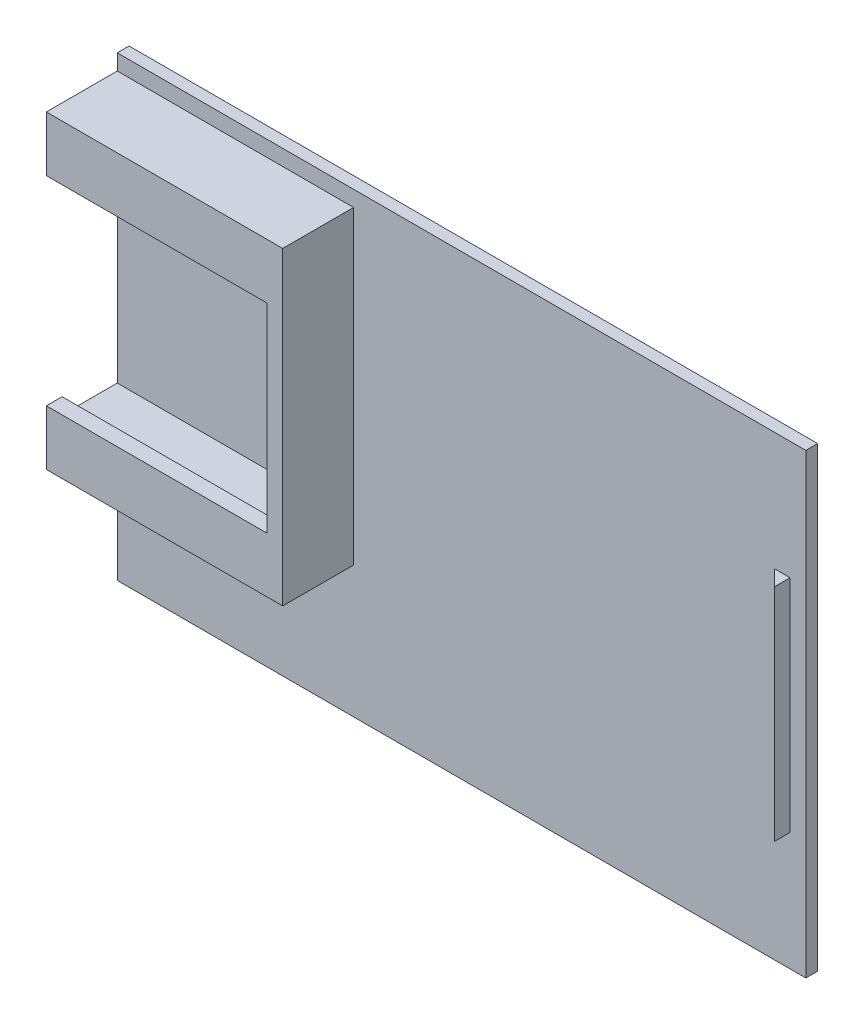
ISO-10303-21;
HEADER;
FILE_DESCRIPTION(('STEP AP214'),'2;1');
FILE_NAME('part.step','',(''),(''),'','','');
FILE_SCHEMA(('AUTOMOTIVE_DESIGN { 1 0 10303 214 1 1 1 1 }'));
ENDSEC;
DATA;
#1=APPLICATION_CONTEXT('core data for automotive mechanical design processes');
#2=APPLICATION_PROTOCOL_DEFINITION('international standard','automotive_design',2000,#1);
#3=PRODUCT_CONTEXT('',#1,'mechanical');
#4=PRODUCT('Part','Part','',(#3));
#5=PRODUCT_RELATED_PRODUCT_CATEGORY('part','',(#4));
#6=PRODUCT_DEFINITION_FORMATION('','',#4);
#7=PRODUCT_DEFINITION_CONTEXT('part definition',#1,'design');
#8=PRODUCT_DEFINITION('design','',#6,#7);
#9=PRODUCT_DEFINITION_SHAPE('','',#8);
#10=(LENGTH_UNIT() NAMED_UNIT(*) SI_UNIT(.MILLI.,.METRE.));
#11=(NAMED_UNIT(*) PLANE_ANGLE_UNIT() SI_UNIT($,.RADIAN.));
#12=(NAMED_UNIT(*) SI_UNIT($,.STERADIAN.) SOLID_ANGLE_UNIT());
#13=UNCERTAINTY_MEASURE_WITH_UNIT(LENGTH_MEASURE(1.E-05),#10,'distance_accuracy_value','');
#14=(GEOMETRIC_REPRESENTATION_CONTEXT(3) GLOBAL_UNCERTAINTY_ASSIGNED_CONTEXT((#13)) GLOBAL_UNIT_ASSIGNED_CONTEXT((#10,
#11,#12)) REPRESENTATION_CONTEXT('',''));
#15=CARTESIAN_POINT('',(0.,0.,0.));
#16=DIRECTION('',(0.,0.,1.));
#17=DIRECTION('',(1.,0.,0.));
#18=AXIS2_PLACEMENT_3D('',#15,#16,#17);
#19=CARTESIAN_POINT('',(39.7,29.,2.));
#20=DIRECTION('',(-0.707106781186547,0.,0.707106781186548));
#21=DIRECTION('',(0.707106781186548,0.,0.707106781186547));
#22=AXIS2_PLACEMENT_3D('',#19,#20,#21);
#23=PLANE('',#22);
#24=DIRECTION('',(0.,-1.,0.));
#25=VECTOR('',#24,1.);
#26=CARTESIAN_POINT('',(41.7,29.,4.));
#27=LINE('',#26,#25);
#28=CARTESIAN_POINT('',(41.7,-0.700000000000003,4.));
#29=VERTEX_POINT('',#28);
#30=CARTESIAN_POINT('',(41.7,-28.7,4.));
#31=VERTEX_POINT('',#30);
#32=EDGE_CURVE('E250',#29,#31,#27,.T.);
#33=ORIENTED_EDGE('',*,*,#32,.F.);
#34=DIRECTION('',(-0.707106781186548,0.,-0.707106781186547));
#35=VECTOR('',#34,1.);
#36=CARTESIAN_POINT('',(39.7,-0.700000000000003,2.));
#37=LINE('',#36,#35);
#38=CARTESIAN_POINT('',(39.7,-0.700000000000002,2.));
#39=VERTEX_POINT('',#38);
#40=EDGE_CURVE('E389',#29,#39,#37,.T.);
#41=ORIENTED_EDGE('',*,*,#40,.T.);
#42=DIRECTION('',(0.,-1.,0.));
#43=VECTOR('',#42,1.);
#44=CARTESIAN_POINT('',(39.7,29.,2.));
#45=LINE('',#44,#43);
#46=CARTESIAN_POINT('',(39.7,-28.7,2.));
#47=VERTEX_POINT('',#46);
#48=EDGE_CURVE('E246',#39,#47,#45,.T.);
#49=ORIENTED_EDGE('',*,*,#48,.T.);
#50=DIRECTION('',(0.707106781186548,0.,0.707106781186547));
#51=VECTOR('',#50,1.);
#52=CARTESIAN_POINT('',(39.7,-28.7,2.00000000000001));
#53=LINE('',#52,#51);
#54=EDGE_CURVE('E391',#47,#31,#53,.T.);
#55=ORIENTED_EDGE('',*,*,#54,.T.);
#56=EDGE_LOOP('',(#33,#41,#49,#55));
#57=FACE_BOUND('',#56,.T.);
#58=ADVANCED_FACE('F65',(#57),#23,.T.);
#59=CARTESIAN_POINT('',(41.7,29.,4.));
#60=DIRECTION('',(1.,0.,0.));
#61=DIRECTION('',(0.,0.,-1.));
#62=AXIS2_PLACEMENT_3D('',#59,#60,#61);
#63=PLANE('',#62);
#64=DIRECTION('',(0.,-1.,0.));
#65=VECTOR('',#64,1.);
#66=CARTESIAN_POINT('',(41.7,29.,2.));
#67=LINE('',#66,#65);
#68=CARTESIAN_POINT('',(41.7,-0.700000000000002,2.));
#69=VERTEX_POINT('',#68);
#70=CARTESIAN_POINT('',(41.7,-28.7,2.));
#71=VERTEX_POINT('',#70);
#72=EDGE_CURVE('E241',#69,#71,#67,.T.);
#73=ORIENTED_EDGE('',*,*,#72,.F.);
#74=DIRECTION('',(0.,0.,1.));
#75=VECTOR('',#74,1.);
#76=CARTESIAN_POINT('',(41.7,-0.700000000000003,4.));
#77=LINE('',#76,#75);
#78=EDGE_CURVE('E73',#69,#29,#77,.T.);
#79=ORIENTED_EDGE('',*,*,#78,.T.);
#80=ORIENTED_EDGE('',*,*,#32,.T.);
#81=DIRECTION('',(0.,0.,-1.));
#82=VECTOR('',#81,1.);
#83=CARTESIAN_POINT('',(41.7,-28.7,4.));
#84=LINE('',#83,#82);
#85=EDGE_CURVE('E376',#31,#71,#84,.T.);
#86=ORIENTED_EDGE('',*,*,#85,.T.);
#87=EDGE_LOOP('',(#73,#79,#80,#86));
#88=FACE_BOUND('',#87,.T.);
#89=ADVANCED_FACE('F383',(#88),#63,.T.);
#90=CARTESIAN_POINT('',(0.,0.,2.));
#91=DIRECTION('',(0.,0.,1.));
#92=DIRECTION('',(1.,0.,0.));
#93=AXIS2_PLACEMENT_3D('',#90,#91,#92);
#94=PLANE('',#93);
#95=DIRECTION('',(0.,1.,0.));
#96=VECTOR('',#95,1.);
#97=CARTESIAN_POINT('',(43.7,29.,2.));
#98=LINE('',#97,#96);
#99=CARTESIAN_POINT('',(43.7,-43.7,2.));
#100=VERTEX_POINT('',#99);
#101=CARTESIAN_POINT('',(43.7,14.3,2.));
#102=VERTEX_POINT('',#101);
#103=EDGE_CURVE('E342',#100,#102,#98,.T.);
#104=ORIENTED_EDGE('',*,*,#103,.T.);
#105=DIRECTION('',(1.,0.,0.));
#106=VECTOR('',#105,1.);
#107=CARTESIAN_POINT('',(0.,14.3,2.));
#108=LINE('',#107,#106);
#109=CARTESIAN_POINT('',(-43.7,14.3,2.));
#110=VERTEX_POINT('',#109);
#111=EDGE_CURVE('E239',#110,#102,#108,.T.);
#112=ORIENTED_EDGE('',*,*,#111,.F.);
#113=DIRECTION('',(0.,-1.,0.));
#114=VECTOR('',#113,1.);
#115=CARTESIAN_POINT('',(-43.7,29.,2.));
#116=LINE('',#115,#114);
#117=CARTESIAN_POINT('',(-43.7,12.3,2.));
#118=VERTEX_POINT('',#117);
#119=EDGE_CURVE('E238',#110,#118,#116,.T.);
#120=ORIENTED_EDGE('',*,*,#119,.T.);
#121=DIRECTION('',(-1.,0.,0.));
#122=VECTOR('',#121,1.);
#123=CARTESIAN_POINT('',(0.,12.3,2.));
#124=LINE('',#123,#122);
#125=CARTESIAN_POINT('',(-13.7,12.3,2.));
#126=VERTEX_POINT('',#125);
#127=EDGE_CURVE('E358',#126,#118,#124,.T.);
#128=ORIENTED_EDGE('',*,*,#127,.F.);
#129=DIRECTION('',(0.,1.,0.));
#130=VECTOR('',#129,1.);
#131=CARTESIAN_POINT('',(-13.7,0.,2.));
#132=LINE('',#131,#130);
#133=CARTESIAN_POINT('',(-13.7,-27.,2.));
#134=VERTEX_POINT('',#133);
#135=EDGE_CURVE('E355',#134,#126,#132,.T.);
#136=ORIENTED_EDGE('',*,*,#135,.F.);
#137=DIRECTION('',(1.,0.,0.));
#138=VECTOR('',#137,1.);
#139=CARTESIAN_POINT('',(0.,-27.,2.));
#140=LINE('',#139,#138);
#141=CARTESIAN_POINT('',(-43.7,-27.,2.));
#142=VERTEX_POINT('',#141);
#143=EDGE_CURVE('E328',#142,#134,#140,.T.);
#144=ORIENTED_EDGE('',*,*,#143,.F.);
#145=CARTESIAN_POINT('',(-43.7,-43.7,2.));
#146=VERTEX_POINT('',#145);
#147=EDGE_CURVE('E374',#142,#146,#116,.T.);
#148=ORIENTED_EDGE('',*,*,#147,.T.);
#149=DIRECTION('',(-1.,0.,0.));
#150=VECTOR('',#149,1.);
#151=CARTESIAN_POINT('',(-43.7,-43.7,2.));
#152=LINE('',#151,#150);
#153=EDGE_CURVE('E396',#100,#146,#152,.T.);
#154=ORIENTED_EDGE('',*,*,#153,.F.);
#155=EDGE_LOOP('',(#104,#112,#120,#128,#136,#144,#148,#154));
#156=FACE_BOUND('',#155,.T.);
#157=DIRECTION('',(1.,0.,0.));
#158=VECTOR('',#157,1.);
#159=CARTESIAN_POINT('',(43.7,-0.700000000000002,2.));
#160=LINE('',#159,#158);
#161=EDGE_CURVE('E394',#39,#69,#160,.T.);
#162=ORIENTED_EDGE('',*,*,#161,.T.);
#163=ORIENTED_EDGE('',*,*,#72,.T.);
#164=DIRECTION('',(-1.,0.,0.));
#165=VECTOR('',#164,1.);
#166=CARTESIAN_POINT('',(43.7,-28.7,2.));
#167=LINE('',#166,#165);
#168=EDGE_CURVE('E398',#71,#47,#167,.T.);
#169=ORIENTED_EDGE('',*,*,#168,.T.);
#170=ORIENTED_EDGE('',*,*,#48,.F.);
#171=EDGE_LOOP('',(#162,#163,#169,#170));
#172=FACE_BOUND('',#171,.T.);
#173=ADVANCED_FACE('F413',(#156,#172),#94,.T.);
#174=CARTESIAN_POINT('',(0.,10.3,11.));
#175=DIRECTION('',(0.,-1.,0.));
#176=DIRECTION('',(1.,0.,0.));
#177=AXIS2_PLACEMENT_3D('',#174,#175,#176);
#178=PLANE('',#177);
#179=DIRECTION('',(0.,0.,-1.));
#180=VECTOR('',#179,1.);
#181=CARTESIAN_POINT('',(-43.7,10.3,11.));
#182=LINE('',#181,#180);
#183=CARTESIAN_POINT('',(-43.7,10.3,9.));
#184=VERTEX_POINT('',#183);
#185=CARTESIAN_POINT('',(-43.7,10.3,7.4));
#186=VERTEX_POINT('',#185);
#187=EDGE_CURVE('E364',#184,#186,#182,.T.);
#188=ORIENTED_EDGE('',*,*,#187,.T.);
#189=DIRECTION('',(-1.,0.,0.));
#190=VECTOR('',#189,1.);
#191=CARTESIAN_POINT('',(-15.7,10.3,7.4));
#192=LINE('',#191,#190);
#193=CARTESIAN_POINT('',(-15.7,10.3,7.4));
#194=VERTEX_POINT('',#193);
#195=EDGE_CURVE('E256',#194,#186,#192,.T.);
#196=ORIENTED_EDGE('',*,*,#195,.F.);
#197=DIRECTION('',(0.,0.,-1.));
#198=VECTOR('',#197,1.);
#199=CARTESIAN_POINT('',(-15.7,10.3,11.));
#200=LINE('',#199,#198);
#201=CARTESIAN_POINT('',(-15.7,10.3,9.));
#202=VERTEX_POINT('',#201);
#203=EDGE_CURVE('E354',#202,#194,#200,.T.);
#204=ORIENTED_EDGE('',*,*,#203,.F.);
#205=DIRECTION('',(1.,0.,0.));
#206=VECTOR('',#205,1.);
#207=CARTESIAN_POINT('',(-43.7,10.3,9.));
#208=LINE('',#207,#206);
#209=EDGE_CURVE('E307',#184,#202,#208,.T.);
#210=ORIENTED_EDGE('',*,*,#209,.F.);
#211=EDGE_LOOP('',(#188,#196,#204,#210));
#212=FACE_BOUND('',#211,.T.);
#213=ADVANCED_FACE('F458',(#212),#178,.T.);
#214=CARTESIAN_POINT('',(-15.7,0.,11.));
#215=DIRECTION('',(-1.,0.,0.));
#216=DIRECTION('',(0.,0.,1.));
#217=AXIS2_PLACEMENT_3D('',#214,#215,#216);
#218=PLANE('',#217);
#219=DIRECTION('',(0.,1.,0.));
#220=VECTOR('',#219,1.);
#221=CARTESIAN_POINT('',(-15.7,10.3,7.4));
#222=LINE('',#221,#220);
#223=CARTESIAN_POINT('',(-15.7,7.29999999999999,7.4));
#224=VERTEX_POINT('',#223);
#225=EDGE_CURVE('E87',#224,#194,#222,.T.);
#226=ORIENTED_EDGE('',*,*,#225,.F.);
#227=DIRECTION('',(0.,0.,-1.));
#228=VECTOR('',#227,1.);
#229=CARTESIAN_POINT('',(-15.7,7.3,7.4));
#230=LINE('',#229,#228);
#231=CARTESIAN_POINT('',(-15.7,7.3,2.));
#232=VERTEX_POINT('',#231);
#233=EDGE_CURVE('E264',#224,#232,#230,.T.);
#234=ORIENTED_EDGE('',*,*,#233,.T.);
#235=DIRECTION('',(0.,1.,0.));
#236=VECTOR('',#235,1.);
#237=CARTESIAN_POINT('',(-15.7,0.,2.));
#238=LINE('',#237,#236);
#239=CARTESIAN_POINT('',(-15.7,-22.,2.));
#240=VERTEX_POINT('',#239);
#241=EDGE_CURVE('E347',#240,#232,#238,.T.);
#242=ORIENTED_EDGE('',*,*,#241,.F.);
#243=DIRECTION('',(0.,0.,-1.));
#244=VECTOR('',#243,1.);
#245=CARTESIAN_POINT('',(-15.7,-22.,7.4));
#246=LINE('',#245,#244);
#247=CARTESIAN_POINT('',(-15.7,-22.,7.4));
#248=VERTEX_POINT('',#247);
#249=EDGE_CURVE('E249',#248,#240,#246,.T.);
#250=ORIENTED_EDGE('',*,*,#249,.F.);
#251=DIRECTION('',(0.,1.,0.));
#252=VECTOR('',#251,1.);
#253=CARTESIAN_POINT('',(-15.7,-25.,7.4));
#254=LINE('',#253,#252);
#255=CARTESIAN_POINT('',(-15.7,-25.,7.4));
#256=VERTEX_POINT('',#255);
#257=EDGE_CURVE('E281',#256,#248,#254,.T.);
#258=ORIENTED_EDGE('',*,*,#257,.F.);
#259=DIRECTION('',(0.,0.,-1.));
#260=VECTOR('',#259,1.);
#261=CARTESIAN_POINT('',(-15.7,-25.,11.));
#262=LINE('',#261,#260);
#263=CARTESIAN_POINT('',(-15.7,-25.,9.));
#264=VERTEX_POINT('',#263);
#265=EDGE_CURVE('E339',#264,#256,#262,.T.);
#266=ORIENTED_EDGE('',*,*,#265,.F.);
#267=DIRECTION('',(0.,-1.,0.));
#268=VECTOR('',#267,1.);
#269=CARTESIAN_POINT('',(-15.7,-25.,9.));
#270=LINE('',#269,#268);
#271=CARTESIAN_POINT('',(-15.7,-20.,9.));
#272=VERTEX_POINT('',#271);
#273=EDGE_CURVE('E317',#272,#264,#270,.T.);
#274=ORIENTED_EDGE('',*,*,#273,.F.);
#275=DIRECTION('',(0.,0.,-1.));
#276=VECTOR('',#275,1.);
#277=CARTESIAN_POINT('',(-15.7,-20.,11.));
#278=LINE('',#277,#276);
#279=CARTESIAN_POINT('',(-15.7,-20.,11.));
#280=VERTEX_POINT('',#279);
#281=EDGE_CURVE('E301',#280,#272,#278,.T.);
#282=ORIENTED_EDGE('',*,*,#281,.F.);
#283=DIRECTION('',(0.,1.,0.));
#284=VECTOR('',#283,1.);
#285=CARTESIAN_POINT('',(-15.7,0.,11.));
#286=LINE('',#285,#284);
#287=CARTESIAN_POINT('',(-15.7,5.3,11.));
#288=VERTEX_POINT('',#287);
#289=EDGE_CURVE('E351',#280,#288,#286,.T.);
#290=ORIENTED_EDGE('',*,*,#289,.T.);
#291=DIRECTION('',(0.,0.,1.));
#292=VECTOR('',#291,1.);
#293=CARTESIAN_POINT('',(-15.7,5.3,11.));
#294=LINE('',#293,#292);
#295=CARTESIAN_POINT('',(-15.7,5.3,9.));
#296=VERTEX_POINT('',#295);
#297=EDGE_CURVE('E294',#296,#288,#294,.T.);
#298=ORIENTED_EDGE('',*,*,#297,.F.);
#299=DIRECTION('',(0.,-1.,0.));
#300=VECTOR('',#299,1.);
#301=CARTESIAN_POINT('',(-15.7,10.3,9.));
#302=LINE('',#301,#300);
#303=EDGE_CURVE('E298',#202,#296,#302,.T.);
#304=ORIENTED_EDGE('',*,*,#303,.F.);
#305=ORIENTED_EDGE('',*,*,#203,.T.);
#306=EDGE_LOOP('',(#226,#234,#242,#250,#258,#266,#274,#282,#290,#298,#304,#305));
#307=FACE_BOUND('',#306,.T.);
#308=ADVANCED_FACE('F431',(#307),#218,.T.);
#309=ORIENTED_EDGE('',*,*,#241,.T.);
#310=DIRECTION('',(1.,0.,0.));
#311=VECTOR('',#310,1.);
#312=CARTESIAN_POINT('',(-15.7,7.3,2.));
#313=LINE('',#312,#311);
#314=CARTESIAN_POINT('',(-43.7,7.29999999999999,2.));
#315=VERTEX_POINT('',#314);
#316=EDGE_CURVE('E257',#315,#232,#313,.T.);
#317=ORIENTED_EDGE('',*,*,#316,.F.);
#318=CARTESIAN_POINT('',(-43.7,-22.,2.));
#319=VERTEX_POINT('',#318);
#320=EDGE_CURVE('E377',#315,#319,#116,.T.);
#321=ORIENTED_EDGE('',*,*,#320,.T.);
#322=DIRECTION('',(-1.,0.,0.));
#323=VECTOR('',#322,1.);
#324=CARTESIAN_POINT('',(-15.7,-22.,2.));
#325=LINE('',#324,#323);
#326=EDGE_CURVE('E267',#240,#319,#325,.T.);
#327=ORIENTED_EDGE('',*,*,#326,.F.);
#328=EDGE_LOOP('',(#309,#317,#321,#327));
#329=FACE_BOUND('',#328,.T.);
#330=ADVANCED_FACE('F419',(#329),#94,.T.);
#331=CARTESIAN_POINT('',(0.,-25.,11.));
#332=DIRECTION('',(0.,1.,0.));
#333=DIRECTION('',(0.,0.,1.));
#334=AXIS2_PLACEMENT_3D('',#331,#332,#333);
#335=PLANE('',#334);
#336=DIRECTION('',(1.,0.,0.));
#337=VECTOR('',#336,1.);
#338=CARTESIAN_POINT('',(-15.7,-25.,7.4));
#339=LINE('',#338,#337);
#340=CARTESIAN_POINT('',(-43.7,-25.,7.4));
#341=VERTEX_POINT('',#340);
#342=EDGE_CURVE('E278',#341,#256,#339,.T.);
#343=ORIENTED_EDGE('',*,*,#342,.F.);
#344=DIRECTION('',(0.,0.,-1.));
#345=VECTOR('',#344,1.);
#346=CARTESIAN_POINT('',(-43.7,-25.,11.));
#347=LINE('',#346,#345);
#348=CARTESIAN_POINT('',(-43.7,-25.,9.));
#349=VERTEX_POINT('',#348);
#350=EDGE_CURVE('E336',#349,#341,#347,.T.);
#351=ORIENTED_EDGE('',*,*,#350,.F.);
#352=DIRECTION('',(1.,0.,0.));
#353=VECTOR('',#352,1.);
#354=CARTESIAN_POINT('',(-43.7,-25.,9.));
#355=LINE('',#354,#353);
#356=EDGE_CURVE('E313',#349,#264,#355,.T.);
#357=ORIENTED_EDGE('',*,*,#356,.T.);
#358=ORIENTED_EDGE('',*,*,#265,.T.);
#359=EDGE_LOOP('',(#343,#351,#357,#358));
#360=FACE_BOUND('',#359,.T.);
#361=ADVANCED_FACE('F434',(#360),#335,.T.);
#362=CARTESIAN_POINT('',(43.7,29.,2.));
#363=DIRECTION('',(-1.,0.,0.));
#364=DIRECTION('',(0.,-1.,0.));
#365=AXIS2_PLACEMENT_3D('',#362,#363,#364);
#366=PLANE('',#365);
#367=DIRECTION('',(0.,0.,-1.));
#368=VECTOR('',#367,1.);
#369=CARTESIAN_POINT('',(43.7,-43.7,2.));
#370=LINE('',#369,#368);
#371=CARTESIAN_POINT('',(43.7,-43.7,0.5));
#372=VERTEX_POINT('',#371);
#373=EDGE_CURVE('E403',#100,#372,#370,.T.);
#374=ORIENTED_EDGE('',*,*,#373,.T.);
#375=DIRECTION('',(0.,1.,0.));
#376=VECTOR('',#375,1.);
#377=CARTESIAN_POINT('',(43.7,-185.7,0.5));
#378=LINE('',#377,#376);
#379=CARTESIAN_POINT('',(43.7,14.3,0.5));
#380=VERTEX_POINT('',#379);
#381=EDGE_CURVE('E79',#372,#380,#378,.T.);
#382=ORIENTED_EDGE('',*,*,#381,.T.);
#383=DIRECTION('',(0.,0.,1.));
#384=VECTOR('',#383,1.);
#385=CARTESIAN_POINT('',(43.7,14.3,-33.));
#386=LINE('',#385,#384);
#387=EDGE_CURVE('E233',#380,#102,#386,.T.);
#388=ORIENTED_EDGE('',*,*,#387,.T.);
#389=ORIENTED_EDGE('',*,*,#103,.F.);
#390=EDGE_LOOP('',(#374,#382,#388,#389));
#391=FACE_BOUND('',#390,.T.);
#392=ADVANCED_FACE('F67',(#391),#366,.F.);
#393=CARTESIAN_POINT('',(-43.7,29.,2.));
#394=DIRECTION('',(1.,0.,0.));
#395=DIRECTION('',(0.,1.,0.));
#396=AXIS2_PLACEMENT_3D('',#393,#394,#395);
#397=PLANE('',#396);
#398=DIRECTION('',(0.,0.,1.));
#399=VECTOR('',#398,1.);
#400=CARTESIAN_POINT('',(-43.7,14.3,-33.));
#401=LINE('',#400,#399);
#402=CARTESIAN_POINT('',(-43.7,14.3,0.5));
#403=VERTEX_POINT('',#402);
#404=EDGE_CURVE('E231',#403,#110,#401,.T.);
#405=ORIENTED_EDGE('',*,*,#404,.F.);
#406=DIRECTION('',(0.,1.,0.));
#407=VECTOR('',#406,1.);
#408=CARTESIAN_POINT('',(-43.7,-185.7,0.5));
#409=LINE('',#408,#407);
#410=CARTESIAN_POINT('',(-43.7,-43.7,0.5));
#411=VERTEX_POINT('',#410);
#412=EDGE_CURVE('E218',#411,#403,#409,.T.);
#413=ORIENTED_EDGE('',*,*,#412,.F.);
#414=DIRECTION('',(0.,0.,-1.));
#415=VECTOR('',#414,1.);
#416=CARTESIAN_POINT('',(-43.7,-43.7,2.));
#417=LINE('',#416,#415);
#418=EDGE_CURVE('E243',#146,#411,#417,.T.);
#419=ORIENTED_EDGE('',*,*,#418,.F.);
#420=ORIENTED_EDGE('',*,*,#147,.F.);
#421=DIRECTION('',(0.,0.,-1.));
#422=VECTOR('',#421,1.);
#423=CARTESIAN_POINT('',(-43.7,-27.,11.));
#424=LINE('',#423,#422);
#425=CARTESIAN_POINT('',(-43.7,-27.,11.));
#426=VERTEX_POINT('',#425);
#427=EDGE_CURVE('E330',#426,#142,#424,.T.);
#428=ORIENTED_EDGE('',*,*,#427,.F.);
#429=DIRECTION('',(0.,-1.,0.));
#430=VECTOR('',#429,1.);
#431=CARTESIAN_POINT('',(-43.7,0.,11.));
#432=LINE('',#431,#430);
#433=CARTESIAN_POINT('',(-43.7,-20.,11.));
#434=VERTEX_POINT('',#433);
#435=EDGE_CURVE('E327',#434,#426,#432,.T.);
#436=ORIENTED_EDGE('',*,*,#435,.F.);
#437=DIRECTION('',(0.,0.,-1.));
#438=VECTOR('',#437,1.);
#439=CARTESIAN_POINT('',(-43.7,-20.,11.));
#440=LINE('',#439,#438);
#441=CARTESIAN_POINT('',(-43.7,-20.,9.));
#442=VERTEX_POINT('',#441);
#443=EDGE_CURVE('E319',#434,#442,#440,.T.);
#444=ORIENTED_EDGE('',*,*,#443,.T.);
#445=DIRECTION('',(0.,-1.,0.));
#446=VECTOR('',#445,1.);
#447=CARTESIAN_POINT('',(-43.7,-25.,9.));
#448=LINE('',#447,#446);
#449=EDGE_CURVE('E316',#442,#349,#448,.T.);
#450=ORIENTED_EDGE('',*,*,#449,.T.);
#451=ORIENTED_EDGE('',*,*,#350,.T.);
#452=DIRECTION('',(0.,-1.,0.));
#453=VECTOR('',#452,1.);
#454=CARTESIAN_POINT('',(-43.7,-25.,7.4));
#455=LINE('',#454,#453);
#456=CARTESIAN_POINT('',(-43.7,-22.,7.4));
#457=VERTEX_POINT('',#456);
#458=EDGE_CURVE('E284',#457,#341,#455,.T.);
#459=ORIENTED_EDGE('',*,*,#458,.F.);
#460=DIRECTION('',(0.,0.,-1.));
#461=VECTOR('',#460,1.);
#462=CARTESIAN_POINT('',(-43.7,-22.,7.4));
#463=LINE('',#462,#461);
#464=EDGE_CURVE('E275',#457,#319,#463,.T.);
#465=ORIENTED_EDGE('',*,*,#464,.T.);
#466=ORIENTED_EDGE('',*,*,#320,.F.);
#467=DIRECTION('',(0.,0.,-1.));
#468=VECTOR('',#467,1.);
#469=CARTESIAN_POINT('',(-43.7,7.29999999999999,7.4));
#470=LINE('',#469,#468);
#471=CARTESIAN_POINT('',(-43.7,7.29999999999999,7.4));
#472=VERTEX_POINT('',#471);
#473=EDGE_CURVE('E269',#472,#315,#470,.T.);
#474=ORIENTED_EDGE('',*,*,#473,.F.);
#475=DIRECTION('',(0.,-1.,0.));
#476=VECTOR('',#475,1.);
#477=CARTESIAN_POINT('',(-43.7,10.3,7.4));
#478=LINE('',#477,#476);
#479=EDGE_CURVE('E260',#186,#472,#478,.T.);
#480=ORIENTED_EDGE('',*,*,#479,.F.);
#481=ORIENTED_EDGE('',*,*,#187,.F.);
#482=DIRECTION('',(0.,-1.,0.));
#483=VECTOR('',#482,1.);
#484=CARTESIAN_POINT('',(-43.7,10.3,9.));
#485=LINE('',#484,#483);
#486=CARTESIAN_POINT('',(-43.7,5.3,9.));
#487=VERTEX_POINT('',#486);
#488=EDGE_CURVE('E291',#184,#487,#485,.T.);
#489=ORIENTED_EDGE('',*,*,#488,.T.);
#490=DIRECTION('',(0.,0.,1.));
#491=VECTOR('',#490,1.);
#492=CARTESIAN_POINT('',(-43.7,5.3,11.));
#493=LINE('',#492,#491);
#494=CARTESIAN_POINT('',(-43.7,5.3,11.));
#495=VERTEX_POINT('',#494);
#496=EDGE_CURVE('E293',#487,#495,#493,.T.);
#497=ORIENTED_EDGE('',*,*,#496,.T.);
#498=DIRECTION('',(0.,-1.,0.));
#499=VECTOR('',#498,1.);
#500=CARTESIAN_POINT('',(-43.7,0.,11.));
#501=LINE('',#500,#499);
#502=CARTESIAN_POINT('',(-43.7,12.3,11.));
#503=VERTEX_POINT('',#502);
#504=EDGE_CURVE('E349',#503,#495,#501,.T.);
#505=ORIENTED_EDGE('',*,*,#504,.F.);
#506=DIRECTION('',(0.,0.,-1.));
#507=VECTOR('',#506,1.);
#508=CARTESIAN_POINT('',(-43.7,12.3,11.));
#509=LINE('',#508,#507);
#510=EDGE_CURVE('E366',#503,#118,#509,.T.);
#511=ORIENTED_EDGE('',*,*,#510,.T.);
#512=ORIENTED_EDGE('',*,*,#119,.F.);
#513=EDGE_LOOP('',(#405,#413,#419,#420,#428,#436,#444,#450,#451,#459,#465,#466,#474,#480,#481,
#489,#497,#505,#511,#512));
#514=FACE_BOUND('',#513,.T.);
#515=ADVANCED_FACE('F236',(#514),#397,.F.);
#516=CARTESIAN_POINT('',(0.,-27.,11.));
#517=DIRECTION('',(0.,1.,0.));
#518=DIRECTION('',(-1.,0.,0.));
#519=AXIS2_PLACEMENT_3D('',#516,#517,#518);
#520=PLANE('',#519);
#521=ORIENTED_EDGE('',*,*,#143,.T.);
#522=DIRECTION('',(0.,0.,-1.));
#523=VECTOR('',#522,1.);
#524=CARTESIAN_POINT('',(-13.7,-27.,11.));
#525=LINE('',#524,#523);
#526=CARTESIAN_POINT('',(-13.7,-27.,11.));
#527=VERTEX_POINT('',#526);
#528=EDGE_CURVE('E309',#527,#134,#525,.T.);
#529=ORIENTED_EDGE('',*,*,#528,.F.);
#530=DIRECTION('',(1.,0.,0.));
#531=VECTOR('',#530,1.);
#532=CARTESIAN_POINT('',(0.,-27.,11.));
#533=LINE('',#532,#531);
#534=EDGE_CURVE('E324',#426,#527,#533,.T.);
#535=ORIENTED_EDGE('',*,*,#534,.F.);
#536=ORIENTED_EDGE('',*,*,#427,.T.);
#537=EDGE_LOOP('',(#521,#529,#535,#536));
#538=FACE_BOUND('',#537,.T.);
#539=ADVANCED_FACE('F516',(#538),#520,.F.);
#540=CARTESIAN_POINT('',(0.,0.,11.));
#541=DIRECTION('',(0.,0.,1.));
#542=DIRECTION('',(1.,0.,0.));
#543=AXIS2_PLACEMENT_3D('',#540,#541,#542);
#544=PLANE('',#543);
#545=ORIENTED_EDGE('',*,*,#504,.T.);
#546=DIRECTION('',(1.,0.,0.));
#547=VECTOR('',#546,1.);
#548=CARTESIAN_POINT('',(-43.7,5.3,11.));
#549=LINE('',#548,#547);
#550=EDGE_CURVE('E297',#495,#288,#549,.T.);
#551=ORIENTED_EDGE('',*,*,#550,.T.);
#552=ORIENTED_EDGE('',*,*,#289,.F.);
#553=DIRECTION('',(1.,0.,0.));
#554=VECTOR('',#553,1.);
#555=CARTESIAN_POINT('',(-43.7,-20.,11.));
#556=LINE('',#555,#554);
#557=EDGE_CURVE('E272',#434,#280,#556,.T.);
#558=ORIENTED_EDGE('',*,*,#557,.F.);
#559=ORIENTED_EDGE('',*,*,#435,.T.);
#560=ORIENTED_EDGE('',*,*,#534,.T.);
#561=DIRECTION('',(0.,1.,0.));
#562=VECTOR('',#561,1.);
#563=CARTESIAN_POINT('',(-13.7,0.,11.));
#564=LINE('',#563,#562);
#565=CARTESIAN_POINT('',(-13.7,12.3,11.));
#566=VERTEX_POINT('',#565);
#567=EDGE_CURVE('E343',#527,#566,#564,.T.);
#568=ORIENTED_EDGE('',*,*,#567,.T.);
#569=DIRECTION('',(-1.,0.,0.));
#570=VECTOR('',#569,1.);
#571=CARTESIAN_POINT('',(0.,12.3,11.));
#572=LINE('',#571,#570);
#573=EDGE_CURVE('E346',#566,#503,#572,.T.);
#574=ORIENTED_EDGE('',*,*,#573,.T.);
#575=EDGE_LOOP('',(#545,#551,#552,#558,#559,#560,#568,#574));
#576=FACE_BOUND('',#575,.T.);
#577=ADVANCED_FACE('F446',(#576),#544,.T.);
#578=CARTESIAN_POINT('',(0.,12.3,11.));
#579=DIRECTION('',(0.,-1.,0.));
#580=DIRECTION('',(0.,0.,-1.));
#581=AXIS2_PLACEMENT_3D('',#578,#579,#580);
#582=PLANE('',#581);
#583=ORIENTED_EDGE('',*,*,#127,.T.);
#584=ORIENTED_EDGE('',*,*,#510,.F.);
#585=ORIENTED_EDGE('',*,*,#573,.F.);
#586=DIRECTION('',(0.,0.,-1.));
#587=VECTOR('',#586,1.);
#588=CARTESIAN_POINT('',(-13.7,12.3,11.));
#589=LINE('',#588,#587);
#590=EDGE_CURVE('E333',#566,#126,#589,.T.);
#591=ORIENTED_EDGE('',*,*,#590,.T.);
#592=EDGE_LOOP('',(#583,#584,#585,#591));
#593=FACE_BOUND('',#592,.T.);
#594=ADVANCED_FACE('F657',(#593),#582,.F.);
#595=CARTESIAN_POINT('',(-13.7,0.,11.));
#596=DIRECTION('',(-1.,0.,0.));
#597=DIRECTION('',(0.,-1.,0.));
#598=AXIS2_PLACEMENT_3D('',#595,#596,#597);
#599=PLANE('',#598);
#600=ORIENTED_EDGE('',*,*,#135,.T.);
#601=ORIENTED_EDGE('',*,*,#590,.F.);
#602=ORIENTED_EDGE('',*,*,#567,.F.);
#603=ORIENTED_EDGE('',*,*,#528,.T.);
#604=EDGE_LOOP('',(#600,#601,#602,#603));
#605=FACE_BOUND('',#604,.T.);
#606=ADVANCED_FACE('F638',(#605),#599,.F.);
#607=CARTESIAN_POINT('',(-43.7,-20.,11.));
#608=DIRECTION('',(0.,-1.,0.));
#609=DIRECTION('',(0.,0.,-1.));
#610=AXIS2_PLACEMENT_3D('',#607,#608,#609);
#611=PLANE('',#610);
#612=ORIENTED_EDGE('',*,*,#281,.T.);
#613=DIRECTION('',(1.,0.,0.));
#614=VECTOR('',#613,1.);
#615=CARTESIAN_POINT('',(-43.7,-20.,9.));
#616=LINE('',#615,#614);
#617=EDGE_CURVE('E311',#442,#272,#616,.T.);
#618=ORIENTED_EDGE('',*,*,#617,.F.);
#619=ORIENTED_EDGE('',*,*,#443,.F.);
#620=ORIENTED_EDGE('',*,*,#557,.T.);
#621=EDGE_LOOP('',(#612,#618,#619,#620));
#622=FACE_BOUND('',#621,.T.);
#623=ADVANCED_FACE('F630',(#622),#611,.F.);
#624=CARTESIAN_POINT('',(-43.7,-25.,9.));
#625=DIRECTION('',(0.,0.,1.));
#626=DIRECTION('',(1.,0.,0.));
#627=AXIS2_PLACEMENT_3D('',#624,#625,#626);
#628=PLANE('',#627);
#629=ORIENTED_EDGE('',*,*,#273,.T.);
#630=ORIENTED_EDGE('',*,*,#356,.F.);
#631=ORIENTED_EDGE('',*,*,#449,.F.);
#632=ORIENTED_EDGE('',*,*,#617,.T.);
#633=EDGE_LOOP('',(#629,#630,#631,#632));
#634=FACE_BOUND('',#633,.T.);
#635=ADVANCED_FACE('F438',(#634),#628,.F.);
#636=CARTESIAN_POINT('',(-43.7,10.3,9.));
#637=DIRECTION('',(0.,0.,1.));
#638=DIRECTION('',(0.,-1.,0.));
#639=AXIS2_PLACEMENT_3D('',#636,#637,#638);
#640=PLANE('',#639);
#641=ORIENTED_EDGE('',*,*,#303,.T.);
#642=DIRECTION('',(1.,0.,0.));
#643=VECTOR('',#642,1.);
#644=CARTESIAN_POINT('',(-43.7,5.3,9.));
#645=LINE('',#644,#643);
#646=EDGE_CURVE('E305',#487,#296,#645,.T.);
#647=ORIENTED_EDGE('',*,*,#646,.F.);
#648=ORIENTED_EDGE('',*,*,#488,.F.);
#649=ORIENTED_EDGE('',*,*,#209,.T.);
#650=EDGE_LOOP('',(#641,#647,#648,#649));
#651=FACE_BOUND('',#650,.T.);
#652=ADVANCED_FACE('F615',(#651),#640,.F.);
#653=CARTESIAN_POINT('',(-43.7,5.3,11.));
#654=DIRECTION('',(0.,1.,0.));
#655=DIRECTION('',(0.,0.,1.));
#656=AXIS2_PLACEMENT_3D('',#653,#654,#655);
#657=PLANE('',#656);
#658=ORIENTED_EDGE('',*,*,#297,.T.);
#659=ORIENTED_EDGE('',*,*,#550,.F.);
#660=ORIENTED_EDGE('',*,*,#496,.F.);
#661=ORIENTED_EDGE('',*,*,#646,.T.);
#662=EDGE_LOOP('',(#658,#659,#660,#661));
#663=FACE_BOUND('',#662,.T.);
#664=ADVANCED_FACE('F451',(#663),#657,.F.);
#665=CARTESIAN_POINT('',(-15.7,-22.,7.4));
#666=DIRECTION('',(0.,-1.,0.));
#667=DIRECTION('',(1.,0.,0.));
#668=AXIS2_PLACEMENT_3D('',#665,#666,#667);
#669=PLANE('',#668);
#670=ORIENTED_EDGE('',*,*,#326,.T.);
#671=ORIENTED_EDGE('',*,*,#464,.F.);
#672=DIRECTION('',(-1.,0.,0.));
#673=VECTOR('',#672,1.);
#674=CARTESIAN_POINT('',(-15.7,-22.,7.4));
#675=LINE('',#674,#673);
#676=EDGE_CURVE('E287',#248,#457,#675,.T.);
#677=ORIENTED_EDGE('',*,*,#676,.F.);
#678=ORIENTED_EDGE('',*,*,#249,.T.);
#679=EDGE_LOOP('',(#670,#671,#677,#678));
#680=FACE_BOUND('',#679,.T.);
#681=ADVANCED_FACE('F424',(#680),#669,.F.);
#682=CARTESIAN_POINT('',(0.,0.,7.4));
#683=DIRECTION('',(0.,0.,1.));
#684=DIRECTION('',(1.,0.,0.));
#685=AXIS2_PLACEMENT_3D('',#682,#683,#684);
#686=PLANE('',#685);
#687=ORIENTED_EDGE('',*,*,#257,.T.);
#688=ORIENTED_EDGE('',*,*,#676,.T.);
#689=ORIENTED_EDGE('',*,*,#458,.T.);
#690=ORIENTED_EDGE('',*,*,#342,.T.);
#691=EDGE_LOOP('',(#687,#688,#689,#690));
#692=FACE_BOUND('',#691,.T.);
#693=ADVANCED_FACE('F429',(#692),#686,.T.);
#694=CARTESIAN_POINT('',(-15.7,7.3,7.4));
#695=DIRECTION('',(0.,1.,0.));
#696=DIRECTION('',(-1.,0.,0.));
#697=AXIS2_PLACEMENT_3D('',#694,#695,#696);
#698=PLANE('',#697);
#699=ORIENTED_EDGE('',*,*,#316,.T.);
#700=ORIENTED_EDGE('',*,*,#233,.F.);
#701=DIRECTION('',(1.,0.,0.));
#702=VECTOR('',#701,1.);
#703=CARTESIAN_POINT('',(-15.7,7.3,7.4));
#704=LINE('',#703,#702);
#705=EDGE_CURVE('E262',#472,#224,#704,.T.);
#706=ORIENTED_EDGE('',*,*,#705,.F.);
#707=ORIENTED_EDGE('',*,*,#473,.T.);
#708=EDGE_LOOP('',(#699,#700,#706,#707));
#709=FACE_BOUND('',#708,.T.);
#710=ADVANCED_FACE('F466',(#709),#698,.F.);
#711=CARTESIAN_POINT('',(0.,0.,7.4));
#712=DIRECTION('',(0.,0.,-1.));
#713=DIRECTION('',(-1.,0.,0.));
#714=AXIS2_PLACEMENT_3D('',#711,#712,#713);
#715=PLANE('',#714);
#716=ORIENTED_EDGE('',*,*,#225,.T.);
#717=ORIENTED_EDGE('',*,*,#195,.T.);
#718=ORIENTED_EDGE('',*,*,#479,.T.);
#719=ORIENTED_EDGE('',*,*,#705,.T.);
#720=EDGE_LOOP('',(#716,#717,#718,#719));
#721=FACE_BOUND('',#720,.T.);
#722=ADVANCED_FACE('F462',(#721),#715,.F.);
#723=CARTESIAN_POINT('',(0.,14.3,-33.));
#724=DIRECTION('',(0.,-1.,0.));
#725=DIRECTION('',(0.,0.,-1.));
#726=AXIS2_PLACEMENT_3D('',#723,#724,#725);
#727=PLANE('',#726);
#728=ORIENTED_EDGE('',*,*,#387,.F.);
#729=DIRECTION('',(1.,0.,0.));
#730=VECTOR('',#729,1.);
#731=CARTESIAN_POINT('',(-43.7,14.3,0.5));
#732=LINE('',#731,#730);
#733=EDGE_CURVE('E221',#403,#380,#732,.T.);
#734=ORIENTED_EDGE('',*,*,#733,.F.);
#735=ORIENTED_EDGE('',*,*,#404,.T.);
#736=ORIENTED_EDGE('',*,*,#111,.T.);
#737=EDGE_LOOP('',(#728,#734,#735,#736));
#738=FACE_BOUND('',#737,.T.);
#739=ADVANCED_FACE('F229',(#738),#727,.F.);
#740=CARTESIAN_POINT('',(-43.7,-43.7,2.));
#741=DIRECTION('',(0.,-1.,0.));
#742=DIRECTION('',(1.,0.,0.));
#743=AXIS2_PLACEMENT_3D('',#740,#741,#742);
#744=PLANE('',#743);
#745=DIRECTION('',(-1.,0.,0.));
#746=VECTOR('',#745,1.);
#747=CARTESIAN_POINT('',(-43.7,-43.7,0.5));
#748=LINE('',#747,#746);
#749=EDGE_CURVE('E12',#372,#411,#748,.T.);
#750=ORIENTED_EDGE('',*,*,#749,.F.);
#751=ORIENTED_EDGE('',*,*,#373,.F.);
#752=ORIENTED_EDGE('',*,*,#153,.T.);
#753=ORIENTED_EDGE('',*,*,#418,.T.);
#754=EDGE_LOOP('',(#750,#751,#752,#753));
#755=FACE_BOUND('',#754,.T.);
#756=ADVANCED_FACE('F410',(#755),#744,.T.);
#757=CARTESIAN_POINT('',(43.7,-28.7,15.));
#758=DIRECTION('',(0.,-1.,0.));
#759=DIRECTION('',(1.,0.,0.));
#760=AXIS2_PLACEMENT_3D('',#757,#758,#759);
#761=PLANE('',#760);
#762=ORIENTED_EDGE('',*,*,#168,.F.);
#763=ORIENTED_EDGE('',*,*,#85,.F.);
#764=ORIENTED_EDGE('',*,*,#54,.F.);
#765=EDGE_LOOP('',(#762,#763,#764));
#766=FACE_BOUND('',#765,.T.);
#767=ADVANCED_FACE('F487',(#766),#761,.T.);
#768=CARTESIAN_POINT('',(43.7,-0.700000000000002,15.));
#769=DIRECTION('',(0.,1.,0.));
#770=DIRECTION('',(-1.,0.,0.));
#771=AXIS2_PLACEMENT_3D('',#768,#769,#770);
#772=PLANE('',#771);
#773=ORIENTED_EDGE('',*,*,#78,.F.);
#774=ORIENTED_EDGE('',*,*,#161,.F.);
#775=ORIENTED_EDGE('',*,*,#40,.F.);
#776=EDGE_LOOP('',(#773,#774,#775));
#777=FACE_BOUND('',#776,.T.);
#778=ADVANCED_FACE('F490',(#777),#772,.T.);
#779=CARTESIAN_POINT('',(-43.7,-185.7,0.5));
#780=DIRECTION('',(0.,0.,1.));
#781=DIRECTION('',(1.,0.,0.));
#782=AXIS2_PLACEMENT_3D('',#779,#780,#781);
#783=PLANE('',#782);
#784=ORIENTED_EDGE('',*,*,#749,.T.);
#785=ORIENTED_EDGE('',*,*,#412,.T.);
#786=ORIENTED_EDGE('',*,*,#733,.T.);
#787=ORIENTED_EDGE('',*,*,#381,.F.);
#788=EDGE_LOOP('',(#784,#785,#786,#787));
#789=FACE_BOUND('',#788,.T.);
#790=ADVANCED_FACE('F220',(#789),#783,.F.);
#791=CLOSED_SHELL('',(#58,#89,#173,#213,#308,#330,#361,#392,#515,#539,#577,#594,#606,#623,#635,
#652,#664,#681,#693,#710,#722,#739,#756,#767,#778,#790));
#792=MANIFOLD_SOLID_BREP('B2',#791);
#793=ADVANCED_BREP_SHAPE_REPRESENTATION('',(#18,#792),#14);
#794=SHAPE_DEFINITION_REPRESENTATION(#9,#793);
ENDSEC;
END-ISO-10303-21;
